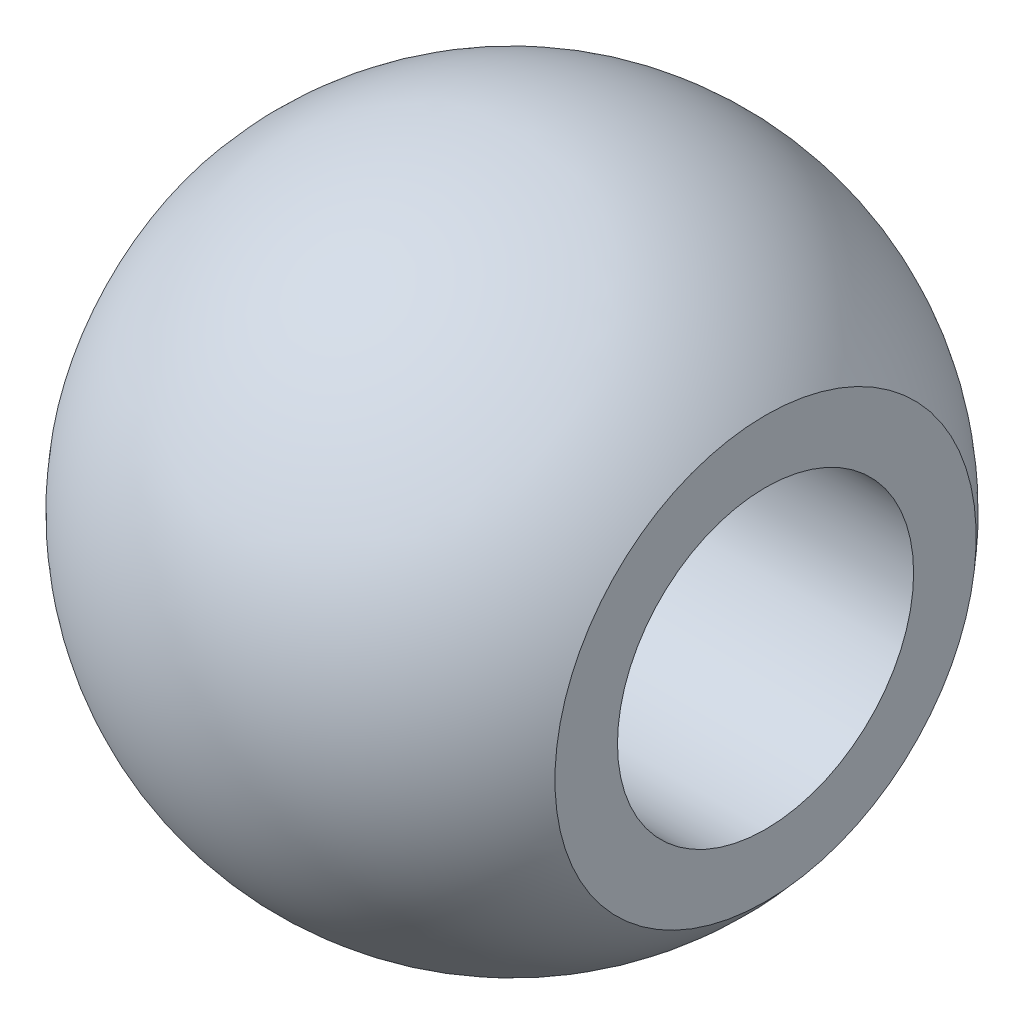
ISO-10303-21;
HEADER;
FILE_DESCRIPTION(('STEP AP214'),'2;1');
FILE_NAME('part.step','',(''),(''),'','','');
FILE_SCHEMA(('AUTOMOTIVE_DESIGN { 1 0 10303 214 1 1 1 1 }'));
ENDSEC;
DATA;
#1=APPLICATION_CONTEXT('core data for automotive mechanical design processes');
#2=APPLICATION_PROTOCOL_DEFINITION('international standard','automotive_design',2000,#1);
#3=PRODUCT_CONTEXT('',#1,'mechanical');
#4=PRODUCT('Part','Part','',(#3));
#5=PRODUCT_RELATED_PRODUCT_CATEGORY('part','',(#4));
#6=PRODUCT_DEFINITION_FORMATION('','',#4);
#7=PRODUCT_DEFINITION_CONTEXT('part definition',#1,'design');
#8=PRODUCT_DEFINITION('design','',#6,#7);
#9=PRODUCT_DEFINITION_SHAPE('','',#8);
#10=(LENGTH_UNIT() NAMED_UNIT(*) SI_UNIT(.MILLI.,.METRE.));
#11=(NAMED_UNIT(*) PLANE_ANGLE_UNIT() SI_UNIT($,.RADIAN.));
#12=(NAMED_UNIT(*) SI_UNIT($,.STERADIAN.) SOLID_ANGLE_UNIT());
#13=UNCERTAINTY_MEASURE_WITH_UNIT(LENGTH_MEASURE(1.E-05),#10,'distance_accuracy_value','');
#14=(GEOMETRIC_REPRESENTATION_CONTEXT(3) GLOBAL_UNCERTAINTY_ASSIGNED_CONTEXT((#13)) GLOBAL_UNIT_ASSIGNED_CONTEXT((#10,
#11,#12)) REPRESENTATION_CONTEXT('',''));
#15=CARTESIAN_POINT('',(0.,0.,0.));
#16=DIRECTION('',(0.,0.,1.));
#17=DIRECTION('',(1.,0.,0.));
#18=AXIS2_PLACEMENT_3D('',#15,#16,#17);
#19=CARTESIAN_POINT('',(0.,0.,0.));
#20=DIRECTION('',(0.,1.,0.));
#21=DIRECTION('',(1.,0.,0.));
#22=AXIS2_PLACEMENT_3D('',#19,#20,#21);
#23=SPHERICAL_SURFACE('',#22,3.25);
#24=CARTESIAN_POINT('',(0.,0.,0.));
#25=DIRECTION('',(1.,0.,0.));
#26=DIRECTION('',(0.,1.,0.));
#27=AXIS2_PLACEMENT_3D('',#24,#25,#26);
#28=SPHERICAL_SURFACE('',#27,3.25);
#29=CARTESIAN_POINT('',(-2.5,0.,0.));
#30=DIRECTION('',(1.,0.,0.));
#31=DIRECTION('',(0.,1.,0.));
#32=AXIS2_PLACEMENT_3D('',#29,#30,#31);
#33=CIRCLE('',#32,2.07665596572952);
#34=CARTESIAN_POINT('',(-2.5,2.07665596572952,0.));
#35=VERTEX_POINT('',#34);
#36=EDGE_CURVE('E42',#35,#35,#33,.T.);
#37=ORIENTED_EDGE('',*,*,#36,.T.);
#38=EDGE_LOOP('',(#37));
#39=FACE_BOUND('',#38,.T.);
#40=CARTESIAN_POINT('',(2.5,0.,0.));
#41=DIRECTION('',(-1.,0.,0.));
#42=DIRECTION('',(0.,-1.,0.));
#43=AXIS2_PLACEMENT_3D('',#40,#41,#42);
#44=CIRCLE('',#43,2.07665596572952);
#45=CARTESIAN_POINT('',(2.5,-2.07665596572952,0.));
#46=VERTEX_POINT('',#45);
#47=EDGE_CURVE('E10',#46,#46,#44,.T.);
#48=ORIENTED_EDGE('',*,*,#47,.T.);
#49=EDGE_LOOP('',(#48));
#50=FACE_BOUND('',#49,.T.);
#51=ADVANCED_FACE('F30',(#39,#50),#28,.T.);
#52=CARTESIAN_POINT('',(-3.25,0.,0.));
#53=DIRECTION('',(1.,0.,0.));
#54=DIRECTION('',(0.,0.,-1.));
#55=AXIS2_PLACEMENT_3D('',#52,#53,#54);
#56=CYLINDRICAL_SURFACE('',#55,1.46);
#57=CARTESIAN_POINT('',(-2.5,0.,0.));
#58=DIRECTION('',(1.,0.,0.));
#59=DIRECTION('',(0.,1.,0.));
#60=AXIS2_PLACEMENT_3D('',#57,#58,#59);
#61=CIRCLE('',#60,1.46);
#62=CARTESIAN_POINT('',(-2.5,1.46,0.));
#63=VERTEX_POINT('',#62);
#64=EDGE_CURVE('E33',#63,#63,#61,.F.);
#65=ORIENTED_EDGE('',*,*,#64,.T.);
#66=EDGE_LOOP('',(#65));
#67=FACE_BOUND('',#66,.T.);
#68=CARTESIAN_POINT('',(2.5,0.,0.));
#69=DIRECTION('',(-1.,0.,0.));
#70=DIRECTION('',(0.,-1.,0.));
#71=AXIS2_PLACEMENT_3D('',#68,#69,#70);
#72=CIRCLE('',#71,1.46);
#73=CARTESIAN_POINT('',(2.5,-1.46,0.));
#74=VERTEX_POINT('',#73);
#75=EDGE_CURVE('E37',#74,#74,#72,.F.);
#76=ORIENTED_EDGE('',*,*,#75,.T.);
#77=EDGE_LOOP('',(#76));
#78=FACE_BOUND('',#77,.T.);
#79=ADVANCED_FACE('F50',(#67,#78),#56,.F.);
#80=CARTESIAN_POINT('',(2.5,0.,-3.25));
#81=DIRECTION('',(-1.,0.,0.));
#82=DIRECTION('',(0.,-1.,0.));
#83=AXIS2_PLACEMENT_3D('',#80,#81,#82);
#84=PLANE('',#83);
#85=ORIENTED_EDGE('',*,*,#75,.F.);
#86=EDGE_LOOP('',(#85));
#87=FACE_BOUND('',#86,.T.);
#88=ORIENTED_EDGE('',*,*,#47,.F.);
#89=EDGE_LOOP('',(#88));
#90=FACE_BOUND('',#89,.T.);
#91=ADVANCED_FACE('F56',(#87,#90),#84,.F.);
#92=CARTESIAN_POINT('',(-2.5,0.,-3.25));
#93=DIRECTION('',(1.,0.,0.));
#94=DIRECTION('',(0.,1.,0.));
#95=AXIS2_PLACEMENT_3D('',#92,#93,#94);
#96=PLANE('',#95);
#97=ORIENTED_EDGE('',*,*,#64,.F.);
#98=EDGE_LOOP('',(#97));
#99=FACE_BOUND('',#98,.T.);
#100=ORIENTED_EDGE('',*,*,#36,.F.);
#101=EDGE_LOOP('',(#100));
#102=FACE_BOUND('',#101,.T.);
#103=ADVANCED_FACE('F53',(#99,#102),#96,.F.);
#104=CLOSED_SHELL('',(#51,#79,#91,#103));
#105=MANIFOLD_SOLID_BREP('B2',#104);
#106=ADVANCED_BREP_SHAPE_REPRESENTATION('',(#18,#105),#14);
#107=SHAPE_DEFINITION_REPRESENTATION(#9,#106);
ENDSEC;
END-ISO-10303-21;
